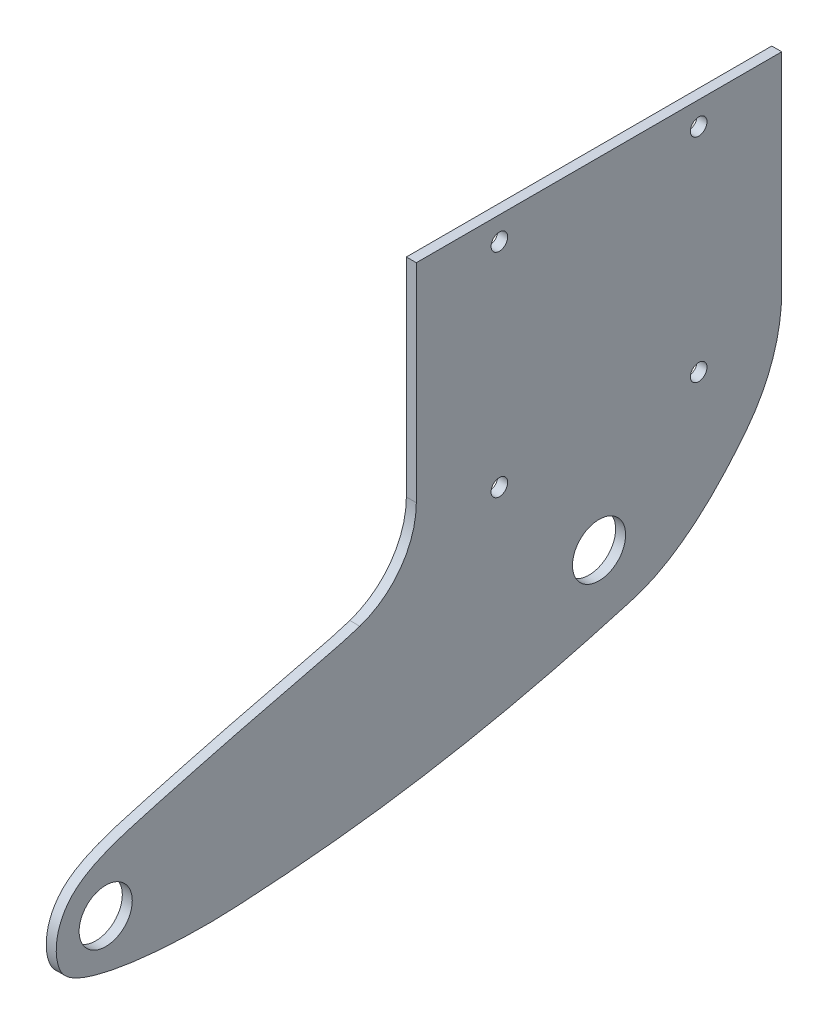
ISO-10303-21;
HEADER;
FILE_DESCRIPTION(('STEP AP214'),'2;1');
FILE_NAME('part.step','',(''),(''),'','','');
FILE_SCHEMA(('AUTOMOTIVE_DESIGN { 1 0 10303 214 1 1 1 1 }'));
ENDSEC;
DATA;
#1=APPLICATION_CONTEXT('core data for automotive mechanical design processes');
#2=APPLICATION_PROTOCOL_DEFINITION('international standard','automotive_design',2000,#1);
#3=PRODUCT_CONTEXT('',#1,'mechanical');
#4=PRODUCT('Part','Part','',(#3));
#5=PRODUCT_RELATED_PRODUCT_CATEGORY('part','',(#4));
#6=PRODUCT_DEFINITION_FORMATION('','',#4);
#7=PRODUCT_DEFINITION_CONTEXT('part definition',#1,'design');
#8=PRODUCT_DEFINITION('design','',#6,#7);
#9=PRODUCT_DEFINITION_SHAPE('','',#8);
#10=(LENGTH_UNIT() NAMED_UNIT(*) SI_UNIT(.MILLI.,.METRE.));
#11=(NAMED_UNIT(*) PLANE_ANGLE_UNIT() SI_UNIT($,.RADIAN.));
#12=(NAMED_UNIT(*) SI_UNIT($,.STERADIAN.) SOLID_ANGLE_UNIT());
#13=UNCERTAINTY_MEASURE_WITH_UNIT(LENGTH_MEASURE(1.E-05),#10,'distance_accuracy_value','');
#14=(GEOMETRIC_REPRESENTATION_CONTEXT(3) GLOBAL_UNCERTAINTY_ASSIGNED_CONTEXT((#13)) GLOBAL_UNIT_ASSIGNED_CONTEXT((#10,
#11,#12)) REPRESENTATION_CONTEXT('',''));
#15=CARTESIAN_POINT('',(0.,0.,0.));
#16=DIRECTION('',(0.,0.,1.));
#17=DIRECTION('',(1.,0.,0.));
#18=AXIS2_PLACEMENT_3D('',#15,#16,#17);
#19=CARTESIAN_POINT('',(0.,-129.938026371312,-22.0610612792701));
#20=DIRECTION('',(1.,0.,0.));
#21=DIRECTION('',(0.,0.,-1.));
#22=AXIS2_PLACEMENT_3D('',#19,#20,#21);
#23=CYLINDRICAL_SURFACE('',#22,50.);
#24=DIRECTION('',(1.,0.,0.));
#25=VECTOR('',#24,1.);
#26=CARTESIAN_POINT('',(0.,-81.6231701911688,-9.18959390790741));
#27=LINE('',#26,#25);
#28=CARTESIAN_POINT('',(0.,-81.6231701911004,-9.1895939081641));
#29=VERTEX_POINT('',#28);
#30=CARTESIAN_POINT('',(-3.,-81.6231701911004,-9.1895939081641));
#31=VERTEX_POINT('',#30);
#32=EDGE_CURVE('E152',#29,#31,#27,.F.);
#33=ORIENTED_EDGE('',*,*,#32,.F.);
#34=CARTESIAN_POINT('',(0.,-129.938026371312,-22.0610612792701));
#35=DIRECTION('',(1.,0.,0.));
#36=DIRECTION('',(0.,0.,-1.));
#37=AXIS2_PLACEMENT_3D('',#34,#35,#36);
#38=CIRCLE('',#37,50.);
#39=CARTESIAN_POINT('',(0.,-81.913406741888,-8.14574922916339));
#40=VERTEX_POINT('',#39);
#41=EDGE_CURVE('E43',#29,#40,#38,.T.);
#42=ORIENTED_EDGE('',*,*,#41,.T.);
#43=DIRECTION('',(1.,0.,0.));
#44=VECTOR('',#43,1.);
#45=CARTESIAN_POINT('',(-3.,-81.9134067418895,-8.145749229158));
#46=LINE('',#45,#44);
#47=CARTESIAN_POINT('',(-3.,-81.913406741888,-8.14574922916339));
#48=VERTEX_POINT('',#47);
#49=EDGE_CURVE('E155',#48,#40,#46,.T.);
#50=ORIENTED_EDGE('',*,*,#49,.F.);
#51=CARTESIAN_POINT('',(-3.,-129.938026371312,-22.0610612792701));
#52=DIRECTION('',(1.,0.,0.));
#53=DIRECTION('',(0.,0.,-1.));
#54=AXIS2_PLACEMENT_3D('',#51,#52,#53);
#55=CIRCLE('',#54,50.);
#56=EDGE_CURVE('E11',#48,#31,#55,.F.);
#57=ORIENTED_EDGE('',*,*,#56,.T.);
#58=EDGE_LOOP('',(#33,#42,#50,#57));
#59=FACE_BOUND('',#58,.T.);
#60=ADVANCED_FACE('F36',(#59),#23,.F.);
#61=CARTESIAN_POINT('',(0.,-23.4880415703172,-4.99999999999923));
#62=DIRECTION('',(1.,0.,0.));
#63=DIRECTION('',(0.,0.,-1.));
#64=AXIS2_PLACEMENT_3D('',#61,#62,#63);
#65=CYLINDRICAL_SURFACE('',#64,50.);
#66=DIRECTION('',(1.,0.,0.));
#67=VECTOR('',#66,1.);
#68=CARTESIAN_POINT('',(-3.,-23.4880415703172,-55.));
#69=LINE('',#68,#67);
#70=CARTESIAN_POINT('',(0.,-23.4880415702987,-55.));
#71=VERTEX_POINT('',#70);
#72=CARTESIAN_POINT('',(-3.,-23.4880415702987,-55.));
#73=VERTEX_POINT('',#72);
#74=EDGE_CURVE('E105',#71,#73,#69,.F.);
#75=ORIENTED_EDGE('',*,*,#74,.F.);
#76=CARTESIAN_POINT('',(0.,-23.4880415703172,-4.99999999999923));
#77=DIRECTION('',(1.,0.,0.));
#78=DIRECTION('',(0.,0.,-1.));
#79=AXIS2_PLACEMENT_3D('',#76,#77,#78);
#80=CIRCLE('',#79,50.);
#81=CARTESIAN_POINT('',(0.,-54.10906440666,-44.5266107888731));
#82=VERTEX_POINT('',#81);
#83=EDGE_CURVE('E148',#82,#71,#80,.T.);
#84=ORIENTED_EDGE('',*,*,#83,.F.);
#85=DIRECTION('',(1.,0.,0.));
#86=VECTOR('',#85,1.);
#87=CARTESIAN_POINT('',(-3.,-54.1090644066626,-44.5266107888713));
#88=LINE('',#87,#86);
#89=CARTESIAN_POINT('',(-3.,-54.1090644066626,-44.5266107888713));
#90=VERTEX_POINT('',#89);
#91=EDGE_CURVE('E145',#90,#82,#88,.T.);
#92=ORIENTED_EDGE('',*,*,#91,.F.);
#93=CARTESIAN_POINT('',(-3.,-23.4880415703172,-4.99999999999923));
#94=DIRECTION('',(1.,0.,0.));
#95=DIRECTION('',(0.,0.,-1.));
#96=AXIS2_PLACEMENT_3D('',#93,#94,#95);
#97=CIRCLE('',#96,50.);
#98=EDGE_CURVE('E150',#73,#90,#97,.F.);
#99=ORIENTED_EDGE('',*,*,#98,.F.);
#100=EDGE_LOOP('',(#75,#84,#92,#99));
#101=FACE_BOUND('',#100,.T.);
#102=ADVANCED_FACE('F268',(#101),#65,.T.);
#103=CARTESIAN_POINT('',(-3.,-23.5711433553628,80.));
#104=DIRECTION('',(1.,0.,0.));
#105=DIRECTION('',(0.,0.,-1.));
#106=AXIS2_PLACEMENT_3D('',#103,#104,#105);
#107=CYLINDRICAL_SURFACE('',#106,25.);
#108=DIRECTION('',(-1.,0.,0.));
#109=VECTOR('',#108,1.);
#110=CARTESIAN_POINT('',(-3.,-23.5711433553628,55.));
#111=LINE('',#110,#109);
#112=CARTESIAN_POINT('',(-3.,-23.5711433553628,55.));
#113=VERTEX_POINT('',#112);
#114=CARTESIAN_POINT('',(0.,-23.5711433553628,55.));
#115=VERTEX_POINT('',#114);
#116=EDGE_CURVE('E132',#113,#115,#111,.F.);
#117=ORIENTED_EDGE('',*,*,#116,.F.);
#118=CARTESIAN_POINT('',(-3.,-23.5711433553628,80.));
#119=DIRECTION('',(1.,0.,0.));
#120=DIRECTION('',(0.,0.,-1.));
#121=AXIS2_PLACEMENT_3D('',#118,#119,#120);
#122=CIRCLE('',#121,25.);
#123=CARTESIAN_POINT('',(-3.,-47.2616225627476,72.0149392660753));
#124=VERTEX_POINT('',#123);
#125=EDGE_CURVE('E139',#113,#124,#122,.F.);
#126=ORIENTED_EDGE('',*,*,#125,.T.);
#127=DIRECTION('',(1.,0.,0.));
#128=VECTOR('',#127,1.);
#129=CARTESIAN_POINT('',(0.,-47.2616225627476,72.0149392660752));
#130=LINE('',#129,#128);
#131=CARTESIAN_POINT('',(0.,-47.2616225627476,72.0149392660753));
#132=VERTEX_POINT('',#131);
#133=EDGE_CURVE('E136',#132,#124,#130,.F.);
#134=ORIENTED_EDGE('',*,*,#133,.F.);
#135=CARTESIAN_POINT('',(0.,-23.5711433553628,80.));
#136=DIRECTION('',(1.,0.,0.));
#137=DIRECTION('',(0.,0.,-1.));
#138=AXIS2_PLACEMENT_3D('',#135,#136,#137);
#139=CIRCLE('',#138,25.);
#140=EDGE_CURVE('E142',#132,#115,#139,.T.);
#141=ORIENTED_EDGE('',*,*,#140,.T.);
#142=EDGE_LOOP('',(#117,#126,#134,#141));
#143=FACE_BOUND('',#142,.T.);
#144=ADVANCED_FACE('F272',(#143),#107,.F.);
#145=CARTESIAN_POINT('',(-3.,39.,-55.));
#146=DIRECTION('',(0.,0.,-1.));
#147=DIRECTION('',(0.,1.,0.));
#148=AXIS2_PLACEMENT_3D('',#145,#146,#147);
#149=PLANE('',#148);
#150=DIRECTION('',(0.,1.,0.));
#151=VECTOR('',#150,1.);
#152=CARTESIAN_POINT('',(0.,39.,-55.));
#153=LINE('',#152,#151);
#154=CARTESIAN_POINT('',(0.,39.,-55.));
#155=VERTEX_POINT('',#154);
#156=EDGE_CURVE('E126',#71,#155,#153,.T.);
#157=ORIENTED_EDGE('',*,*,#156,.F.);
#158=ORIENTED_EDGE('',*,*,#74,.T.);
#159=DIRECTION('',(0.,1.,0.));
#160=VECTOR('',#159,1.);
#161=CARTESIAN_POINT('',(-3.,39.,-55.));
#162=LINE('',#161,#160);
#163=CARTESIAN_POINT('',(-3.,39.,-55.));
#164=VERTEX_POINT('',#163);
#165=EDGE_CURVE('E98',#73,#164,#162,.T.);
#166=ORIENTED_EDGE('',*,*,#165,.T.);
#167=DIRECTION('',(1.,0.,0.));
#168=VECTOR('',#167,1.);
#169=CARTESIAN_POINT('',(-3.,39.,-55.));
#170=LINE('',#169,#168);
#171=EDGE_CURVE('E102',#164,#155,#170,.T.);
#172=ORIENTED_EDGE('',*,*,#171,.T.);
#173=EDGE_LOOP('',(#157,#158,#166,#172));
#174=FACE_BOUND('',#173,.T.);
#175=ADVANCED_FACE('F101',(#174),#149,.T.);
#176=CARTESIAN_POINT('',(-3.,39.,55.));
#177=DIRECTION('',(0.,0.,1.));
#178=DIRECTION('',(1.,0.,0.));
#179=AXIS2_PLACEMENT_3D('',#176,#177,#178);
#180=PLANE('',#179);
#181=DIRECTION('',(0.,-1.,0.));
#182=VECTOR('',#181,1.);
#183=CARTESIAN_POINT('',(-3.,39.,55.));
#184=LINE('',#183,#182);
#185=CARTESIAN_POINT('',(-3.,39.,55.));
#186=VERTEX_POINT('',#185);
#187=EDGE_CURVE('E116',#186,#113,#184,.T.);
#188=ORIENTED_EDGE('',*,*,#187,.T.);
#189=ORIENTED_EDGE('',*,*,#116,.T.);
#190=DIRECTION('',(0.,-1.,0.));
#191=VECTOR('',#190,1.);
#192=CARTESIAN_POINT('',(0.,39.,55.));
#193=LINE('',#192,#191);
#194=CARTESIAN_POINT('',(0.,39.,55.));
#195=VERTEX_POINT('',#194);
#196=EDGE_CURVE('E108',#195,#115,#193,.T.);
#197=ORIENTED_EDGE('',*,*,#196,.F.);
#198=DIRECTION('',(1.,0.,0.));
#199=VECTOR('',#198,1.);
#200=CARTESIAN_POINT('',(-3.,39.,55.));
#201=LINE('',#200,#199);
#202=EDGE_CURVE('E115',#186,#195,#201,.T.);
#203=ORIENTED_EDGE('',*,*,#202,.F.);
#204=EDGE_LOOP('',(#188,#189,#197,#203));
#205=FACE_BOUND('',#204,.T.);
#206=ADVANCED_FACE('F280',(#205),#180,.T.);
#207=CARTESIAN_POINT('',(-3.,39.,55.));
#208=DIRECTION('',(0.,1.,0.));
#209=DIRECTION('',(0.,0.,1.));
#210=AXIS2_PLACEMENT_3D('',#207,#208,#209);
#211=PLANE('',#210);
#212=DIRECTION('',(0.,0.,1.));
#213=VECTOR('',#212,1.);
#214=CARTESIAN_POINT('',(0.,39.,55.));
#215=LINE('',#214,#213);
#216=EDGE_CURVE('E114',#155,#195,#215,.T.);
#217=ORIENTED_EDGE('',*,*,#216,.F.);
#218=ORIENTED_EDGE('',*,*,#171,.F.);
#219=DIRECTION('',(0.,0.,1.));
#220=VECTOR('',#219,1.);
#221=CARTESIAN_POINT('',(-3.,39.,55.));
#222=LINE('',#221,#220);
#223=EDGE_CURVE('E107',#164,#186,#222,.T.);
#224=ORIENTED_EDGE('',*,*,#223,.T.);
#225=ORIENTED_EDGE('',*,*,#202,.T.);
#226=EDGE_LOOP('',(#217,#218,#224,#225));
#227=FACE_BOUND('',#226,.T.);
#228=ADVANCED_FACE('F112',(#227),#211,.T.);
#229=CARTESIAN_POINT('',(-3.,0.,0.));
#230=DIRECTION('',(1.,0.,0.));
#231=DIRECTION('',(0.,0.,-1.));
#232=AXIS2_PLACEMENT_3D('',#229,#230,#231);
#233=PLANE('',#232);
#234=ORIENTED_EDGE('',*,*,#56,.F.);
#235=CARTESIAN_POINT('',(-3.,-39.,55.));
#236=CARTESIAN_POINT('',(-3.,-51.2180326584955,76.3026835310571));
#237=CARTESIAN_POINT('',(-3.,-45.3030573613227,70.1095241212538));
#238=CARTESIAN_POINT('',(-3.,-71.027008298777,161.547750012645));
#239=CARTESIAN_POINT('',(-3.,-86.97174517992,164.758151479717));
#240=CARTESIAN_POINT('',(-3.,-99.3413425777492,158.631115558747));
#241=CARTESIAN_POINT('',(-3.,-102.770423292542,127.046211040209));
#242=CARTESIAN_POINT('',(-3.,-100.195746793213,79.7858993784994));
#243=CARTESIAN_POINT('',(-3.,-95.4911159969836,37.7117129607729));
#244=CARTESIAN_POINT('',(-3.,-80.9380878672458,-11.4765719856305));
#245=B_SPLINE_CURVE_WITH_KNOTS('',3,(#235,#236,#237,#238,#239,#240,#241,#242,#243,#244),
.UNSPECIFIED.,.F.,.F.,(4,1,1,1,1,1,1,4),(0.,0.550055956630513,0.61965452330945,
0.687504428624938,0.706722521547217,0.792617359609956,0.823018792931019,1.),.UNSPECIFIED.);
#246=EDGE_CURVE('E162',#48,#124,#245,.F.);
#247=ORIENTED_EDGE('',*,*,#246,.T.);
#248=ORIENTED_EDGE('',*,*,#125,.F.);
#249=ORIENTED_EDGE('',*,*,#187,.F.);
#250=ORIENTED_EDGE('',*,*,#223,.F.);
#251=ORIENTED_EDGE('',*,*,#165,.F.);
#252=ORIENTED_EDGE('',*,*,#98,.T.);
#253=CARTESIAN_POINT('',(-3.,999917.142067946,8307.25916598712));
#254=CARTESIAN_POINT('',(-3.,-1000082.84726602,-1.2839408542753));
#255=CARTESIAN_POINT('',(-3.,999917.163396708,-8304.69128427857));
#256=B_SPLINE_CURVE_WITH_KNOTS('',2,(#253,#254,#255),.UNSPECIFIED.,.F.,.F.,(3,3),(0.,1.),.UNSPECIFIED.);
#257=EDGE_CURVE('E223',#90,#31,#256,.F.);
#258=ORIENTED_EDGE('',*,*,#257,.T.);
#259=EDGE_LOOP('',(#234,#247,#248,#249,#250,#251,#252,#258));
#260=FACE_BOUND('',#259,.T.);
#261=CARTESIAN_POINT('',(-3.,-63.4264657128227,7.68835784274864E-06));
#262=DIRECTION('',(1.,0.,0.));
#263=DIRECTION('',(0.,0.,-1.));
#264=AXIS2_PLACEMENT_3D('',#261,#262,#263);
#265=CIRCLE('',#264,8.00000000000001);
#266=CARTESIAN_POINT('',(-3.,-63.4264657128227,-7.99999231164216));
#267=VERTEX_POINT('',#266);
#268=EDGE_CURVE('E191',#267,#267,#265,.T.);
#269=ORIENTED_EDGE('',*,*,#268,.T.);
#270=EDGE_LOOP('',(#269));
#271=FACE_BOUND('',#270,.T.);
#272=CARTESIAN_POINT('',(-3.,32.,30.));
#273=DIRECTION('',(1.,0.,0.));
#274=DIRECTION('',(0.,0.,1.));
#275=AXIS2_PLACEMENT_3D('',#272,#273,#274);
#276=CIRCLE('',#275,2.5);
#277=CARTESIAN_POINT('',(-3.,32.,32.5));
#278=VERTEX_POINT('',#277);
#279=EDGE_CURVE('E231',#278,#278,#276,.T.);
#280=ORIENTED_EDGE('',*,*,#279,.T.);
#281=EDGE_LOOP('',(#280));
#282=FACE_BOUND('',#281,.T.);
#283=CARTESIAN_POINT('',(-3.,-32.,30.));
#284=DIRECTION('',(1.,0.,0.));
#285=DIRECTION('',(0.,0.,-1.));
#286=AXIS2_PLACEMENT_3D('',#283,#284,#285);
#287=CIRCLE('',#286,2.5);
#288=CARTESIAN_POINT('',(-3.,-32.,27.5));
#289=VERTEX_POINT('',#288);
#290=EDGE_CURVE('E240',#289,#289,#287,.T.);
#291=ORIENTED_EDGE('',*,*,#290,.T.);
#292=EDGE_LOOP('',(#291));
#293=FACE_BOUND('',#292,.T.);
#294=CARTESIAN_POINT('',(-3.,-32.,-30.));
#295=DIRECTION('',(1.,0.,0.));
#296=DIRECTION('',(0.,0.,1.));
#297=AXIS2_PLACEMENT_3D('',#294,#295,#296);
#298=CIRCLE('',#297,2.5);
#299=CARTESIAN_POINT('',(-3.,-32.,-27.5));
#300=VERTEX_POINT('',#299);
#301=EDGE_CURVE('E246',#300,#300,#298,.T.);
#302=ORIENTED_EDGE('',*,*,#301,.T.);
#303=EDGE_LOOP('',(#302));
#304=FACE_BOUND('',#303,.T.);
#305=CARTESIAN_POINT('',(-3.,32.,-30.));
#306=DIRECTION('',(1.,0.,0.));
#307=DIRECTION('',(0.,0.,-1.));
#308=AXIS2_PLACEMENT_3D('',#305,#306,#307);
#309=CIRCLE('',#308,2.5);
#310=CARTESIAN_POINT('',(-3.,32.,-32.5));
#311=VERTEX_POINT('',#310);
#312=EDGE_CURVE('E128',#311,#311,#309,.T.);
#313=ORIENTED_EDGE('',*,*,#312,.T.);
#314=EDGE_LOOP('',(#313));
#315=FACE_BOUND('',#314,.T.);
#316=CARTESIAN_POINT('',(-3.,-84.5370983543939,148.507048563438));
#317=DIRECTION('',(1.,0.,0.));
#318=DIRECTION('',(0.,0.,-1.));
#319=AXIS2_PLACEMENT_3D('',#316,#317,#318);
#320=CIRCLE('',#319,8.00000000000001);
#321=CARTESIAN_POINT('',(-3.,-84.5370983543939,140.507048563438));
#322=VERTEX_POINT('',#321);
#323=EDGE_CURVE('E172',#322,#322,#320,.F.);
#324=ORIENTED_EDGE('',*,*,#323,.F.);
#325=EDGE_LOOP('',(#324));
#326=FACE_BOUND('',#325,.T.);
#327=ADVANCED_FACE('F119',(#260,#271,#282,#293,#304,#315,#326),#233,.F.);
#328=CARTESIAN_POINT('',(0.,0.,0.));
#329=DIRECTION('',(1.,0.,0.));
#330=DIRECTION('',(0.,0.,-1.));
#331=AXIS2_PLACEMENT_3D('',#328,#329,#330);
#332=PLANE('',#331);
#333=ORIENTED_EDGE('',*,*,#41,.F.);
#334=CARTESIAN_POINT('',(0.,999917.142067946,8307.25916598712));
#335=CARTESIAN_POINT('',(0.,-1000082.84726602,-1.2839408542753));
#336=CARTESIAN_POINT('',(0.,999917.163396708,-8304.69128427857));
#337=B_SPLINE_CURVE_WITH_KNOTS('',2,(#334,#335,#336),.UNSPECIFIED.,.F.,.F.,(3,3),(0.,1.),.UNSPECIFIED.);
#338=EDGE_CURVE('E216',#29,#82,#337,.T.);
#339=ORIENTED_EDGE('',*,*,#338,.T.);
#340=ORIENTED_EDGE('',*,*,#83,.T.);
#341=ORIENTED_EDGE('',*,*,#156,.T.);
#342=ORIENTED_EDGE('',*,*,#216,.T.);
#343=ORIENTED_EDGE('',*,*,#196,.T.);
#344=ORIENTED_EDGE('',*,*,#140,.F.);
#345=CARTESIAN_POINT('',(0.,-39.,55.));
#346=CARTESIAN_POINT('',(0.,-51.2180326584955,76.3026835310571));
#347=CARTESIAN_POINT('',(0.,-45.3030573613227,70.1095241212538));
#348=CARTESIAN_POINT('',(0.,-71.027008298777,161.547750012645));
#349=CARTESIAN_POINT('',(0.,-86.97174517992,164.758151479717));
#350=CARTESIAN_POINT('',(0.,-99.3413425777492,158.631115558747));
#351=CARTESIAN_POINT('',(0.,-102.770423292542,127.046211040209));
#352=CARTESIAN_POINT('',(0.,-100.195746793213,79.7858993784994));
#353=CARTESIAN_POINT('',(0.,-95.4911159969836,37.7117129607729));
#354=CARTESIAN_POINT('',(0.,-80.9380878672458,-11.4765719856305));
#355=B_SPLINE_CURVE_WITH_KNOTS('',3,(#345,#346,#347,#348,#349,#350,#351,#352,#353,#354),
.UNSPECIFIED.,.F.,.F.,(4,1,1,1,1,1,1,4),(0.,0.550055956630513,0.61965452330945,
0.687504428624938,0.706722521547217,0.792617359609956,0.823018792931019,1.),.UNSPECIFIED.);
#356=EDGE_CURVE('E161',#132,#40,#355,.T.);
#357=ORIENTED_EDGE('',*,*,#356,.T.);
#358=EDGE_LOOP('',(#333,#339,#340,#341,#342,#343,#344,#357));
#359=FACE_BOUND('',#358,.T.);
#360=CARTESIAN_POINT('',(0.,-63.4264657128227,7.68835784274864E-06));
#361=DIRECTION('',(1.,0.,0.));
#362=DIRECTION('',(0.,0.,-1.));
#363=AXIS2_PLACEMENT_3D('',#360,#361,#362);
#364=CIRCLE('',#363,8.00000000000001);
#365=CARTESIAN_POINT('',(0.,-63.4264657128227,-7.99999231164216));
#366=VERTEX_POINT('',#365);
#367=EDGE_CURVE('E169',#366,#366,#364,.T.);
#368=ORIENTED_EDGE('',*,*,#367,.F.);
#369=EDGE_LOOP('',(#368));
#370=FACE_BOUND('',#369,.T.);
#371=CARTESIAN_POINT('',(0.,32.,30.));
#372=DIRECTION('',(1.,0.,0.));
#373=DIRECTION('',(0.,0.,1.));
#374=AXIS2_PLACEMENT_3D('',#371,#372,#373);
#375=CIRCLE('',#374,2.5);
#376=CARTESIAN_POINT('',(0.,32.,32.5));
#377=VERTEX_POINT('',#376);
#378=EDGE_CURVE('E230',#377,#377,#375,.T.);
#379=ORIENTED_EDGE('',*,*,#378,.F.);
#380=EDGE_LOOP('',(#379));
#381=FACE_BOUND('',#380,.T.);
#382=CARTESIAN_POINT('',(0.,-32.,30.));
#383=DIRECTION('',(1.,0.,0.));
#384=DIRECTION('',(0.,0.,-1.));
#385=AXIS2_PLACEMENT_3D('',#382,#383,#384);
#386=CIRCLE('',#385,2.5);
#387=CARTESIAN_POINT('',(0.,-32.,27.5));
#388=VERTEX_POINT('',#387);
#389=EDGE_CURVE('E237',#388,#388,#386,.T.);
#390=ORIENTED_EDGE('',*,*,#389,.F.);
#391=EDGE_LOOP('',(#390));
#392=FACE_BOUND('',#391,.T.);
#393=CARTESIAN_POINT('',(0.,-32.,-30.));
#394=DIRECTION('',(1.,0.,0.));
#395=DIRECTION('',(0.,0.,1.));
#396=AXIS2_PLACEMENT_3D('',#393,#394,#395);
#397=CIRCLE('',#396,2.5);
#398=CARTESIAN_POINT('',(0.,-32.,-27.5));
#399=VERTEX_POINT('',#398);
#400=EDGE_CURVE('E243',#399,#399,#397,.T.);
#401=ORIENTED_EDGE('',*,*,#400,.F.);
#402=EDGE_LOOP('',(#401));
#403=FACE_BOUND('',#402,.T.);
#404=CARTESIAN_POINT('',(0.,32.,-30.));
#405=DIRECTION('',(1.,0.,0.));
#406=DIRECTION('',(0.,0.,-1.));
#407=AXIS2_PLACEMENT_3D('',#404,#405,#406);
#408=CIRCLE('',#407,2.5);
#409=CARTESIAN_POINT('',(0.,32.,-32.5));
#410=VERTEX_POINT('',#409);
#411=EDGE_CURVE('E249',#410,#410,#408,.T.);
#412=ORIENTED_EDGE('',*,*,#411,.F.);
#413=EDGE_LOOP('',(#412));
#414=FACE_BOUND('',#413,.T.);
#415=CARTESIAN_POINT('',(0.,-84.5370983543939,148.507048563438));
#416=DIRECTION('',(1.,0.,0.));
#417=DIRECTION('',(0.,0.,-1.));
#418=AXIS2_PLACEMENT_3D('',#415,#416,#417);
#419=CIRCLE('',#418,8.00000000000001);
#420=CARTESIAN_POINT('',(0.,-84.5370983543939,140.507048563438));
#421=VERTEX_POINT('',#420);
#422=EDGE_CURVE('E167',#421,#421,#419,.T.);
#423=ORIENTED_EDGE('',*,*,#422,.F.);
#424=EDGE_LOOP('',(#423));
#425=FACE_BOUND('',#424,.T.);
#426=ADVANCED_FACE('F164',(#359,#370,#381,#392,#403,#414,#425),#332,.T.);
#427=CARTESIAN_POINT('',(-3.,32.,-30.));
#428=DIRECTION('',(1.,0.,0.));
#429=DIRECTION('',(0.,0.,-1.));
#430=AXIS2_PLACEMENT_3D('',#427,#428,#429);
#431=CYLINDRICAL_SURFACE('',#430,2.5);
#432=ORIENTED_EDGE('',*,*,#312,.F.);
#433=EDGE_LOOP('',(#432));
#434=FACE_BOUND('',#433,.T.);
#435=ORIENTED_EDGE('',*,*,#411,.T.);
#436=EDGE_LOOP('',(#435));
#437=FACE_BOUND('',#436,.T.);
#438=ADVANCED_FACE('F256',(#434,#437),#431,.F.);
#439=CARTESIAN_POINT('',(-3.,-32.,-30.));
#440=DIRECTION('',(1.,0.,0.));
#441=DIRECTION('',(0.,0.,-1.));
#442=AXIS2_PLACEMENT_3D('',#439,#440,#441);
#443=CYLINDRICAL_SURFACE('',#442,2.5);
#444=ORIENTED_EDGE('',*,*,#301,.F.);
#445=EDGE_LOOP('',(#444));
#446=FACE_BOUND('',#445,.T.);
#447=ORIENTED_EDGE('',*,*,#400,.T.);
#448=EDGE_LOOP('',(#447));
#449=FACE_BOUND('',#448,.T.);
#450=ADVANCED_FACE('F298',(#446,#449),#443,.F.);
#451=CARTESIAN_POINT('',(-3.,-32.,30.));
#452=DIRECTION('',(1.,0.,0.));
#453=DIRECTION('',(0.,0.,-1.));
#454=AXIS2_PLACEMENT_3D('',#451,#452,#453);
#455=CYLINDRICAL_SURFACE('',#454,2.5);
#456=ORIENTED_EDGE('',*,*,#290,.F.);
#457=EDGE_LOOP('',(#456));
#458=FACE_BOUND('',#457,.T.);
#459=ORIENTED_EDGE('',*,*,#389,.T.);
#460=EDGE_LOOP('',(#459));
#461=FACE_BOUND('',#460,.T.);
#462=ADVANCED_FACE('F301',(#458,#461),#455,.F.);
#463=CARTESIAN_POINT('',(-3.,32.,30.));
#464=DIRECTION('',(1.,0.,0.));
#465=DIRECTION('',(0.,0.,-1.));
#466=AXIS2_PLACEMENT_3D('',#463,#464,#465);
#467=CYLINDRICAL_SURFACE('',#466,2.5);
#468=ORIENTED_EDGE('',*,*,#279,.F.);
#469=EDGE_LOOP('',(#468));
#470=FACE_BOUND('',#469,.T.);
#471=ORIENTED_EDGE('',*,*,#378,.T.);
#472=EDGE_LOOP('',(#471));
#473=FACE_BOUND('',#472,.T.);
#474=ADVANCED_FACE('F209',(#470,#473),#467,.F.);
#475=CARTESIAN_POINT('',(-121.416800115097,999917.142067946,8307.25916598712));
#476=CARTESIAN_POINT('',(-121.416800115097,-1000082.84726602,-1.2839408542753));
#477=CARTESIAN_POINT('',(-121.416800115097,999917.163396708,-8304.69128427857));
#478=B_SPLINE_CURVE_WITH_KNOTS('',2,(#475,#476,#477),.UNSPECIFIED.,.F.,.F.,(3,3),(0.,1.),.UNSPECIFIED.);
#479=DIRECTION('',(1.,0.,0.));
#480=VECTOR('',#479,1.);
#481=SURFACE_OF_LINEAR_EXTRUSION('',#478,#480);
#482=ORIENTED_EDGE('',*,*,#338,.F.);
#483=ORIENTED_EDGE('',*,*,#32,.T.);
#484=ORIENTED_EDGE('',*,*,#257,.F.);
#485=ORIENTED_EDGE('',*,*,#91,.T.);
#486=EDGE_LOOP('',(#482,#483,#484,#485));
#487=FACE_BOUND('',#486,.T.);
#488=ADVANCED_FACE('F204',(#487),#481,.T.);
#489=CARTESIAN_POINT('',(-3.,-63.4264657128227,7.68835784274864E-06));
#490=DIRECTION('',(1.,0.,0.));
#491=DIRECTION('',(0.,0.,-1.));
#492=AXIS2_PLACEMENT_3D('',#489,#490,#491);
#493=CYLINDRICAL_SURFACE('',#492,8.00000000000001);
#494=ORIENTED_EDGE('',*,*,#268,.F.);
#495=EDGE_LOOP('',(#494));
#496=FACE_BOUND('',#495,.T.);
#497=ORIENTED_EDGE('',*,*,#367,.T.);
#498=EDGE_LOOP('',(#497));
#499=FACE_BOUND('',#498,.T.);
#500=ADVANCED_FACE('F201',(#496,#499),#493,.F.);
#501=CARTESIAN_POINT('',(-186.544901085384,-84.5370983543939,148.507048563438));
#502=DIRECTION('',(1.,0.,0.));
#503=DIRECTION('',(0.,0.,-1.));
#504=AXIS2_PLACEMENT_3D('',#501,#502,#503);
#505=CYLINDRICAL_SURFACE('',#504,8.00000000000001);
#506=ORIENTED_EDGE('',*,*,#323,.T.);
#507=EDGE_LOOP('',(#506));
#508=FACE_BOUND('',#507,.T.);
#509=ORIENTED_EDGE('',*,*,#422,.T.);
#510=EDGE_LOOP('',(#509));
#511=FACE_BOUND('',#510,.T.);
#512=ADVANCED_FACE('F200',(#508,#511),#505,.F.);
#513=CARTESIAN_POINT('',(-186.544901085384,-39.,55.));
#514=CARTESIAN_POINT('',(-186.544901085384,-51.2180326584955,76.3026835310571));
#515=CARTESIAN_POINT('',(-186.544901085384,-45.3030573613227,70.1095241212538));
#516=CARTESIAN_POINT('',(-186.544901085384,-71.027008298777,161.547750012645));
#517=CARTESIAN_POINT('',(-186.544901085384,-86.97174517992,164.758151479717));
#518=CARTESIAN_POINT('',(-186.544901085384,-99.3413425777492,158.631115558747));
#519=CARTESIAN_POINT('',(-186.544901085384,-102.770423292542,127.046211040209));
#520=CARTESIAN_POINT('',(-186.544901085384,-100.195746793213,79.7858993784994));
#521=CARTESIAN_POINT('',(-186.544901085384,-95.4911159969836,37.7117129607729));
#522=CARTESIAN_POINT('',(-186.544901085384,-80.9380878672458,-11.4765719856305));
#523=B_SPLINE_CURVE_WITH_KNOTS('',3,(#513,#514,#515,#516,#517,#518,#519,#520,#521,#522),
.UNSPECIFIED.,.F.,.F.,(4,1,1,1,1,1,1,4),(0.,0.550055956630513,0.61965452330945,
0.687504428624938,0.706722521547217,0.792617359609956,0.823018792931019,1.),.UNSPECIFIED.);
#524=DIRECTION('',(1.,0.,0.));
#525=VECTOR('',#524,1.);
#526=SURFACE_OF_LINEAR_EXTRUSION('',#523,#525);
#527=ORIENTED_EDGE('',*,*,#246,.F.);
#528=ORIENTED_EDGE('',*,*,#49,.T.);
#529=ORIENTED_EDGE('',*,*,#356,.F.);
#530=ORIENTED_EDGE('',*,*,#133,.T.);
#531=EDGE_LOOP('',(#527,#528,#529,#530));
#532=FACE_BOUND('',#531,.T.);
#533=ADVANCED_FACE('F160',(#532),#526,.T.);
#534=CLOSED_SHELL('',(#60,#102,#144,#175,#206,#228,#327,#426,#438,#450,#462,#474,#488,#500,#512,#533));
#535=MANIFOLD_SOLID_BREP('B2',#534);
#536=ADVANCED_BREP_SHAPE_REPRESENTATION('',(#18,#535),#14);
#537=SHAPE_DEFINITION_REPRESENTATION(#9,#536);
ENDSEC;
END-ISO-10303-21;
